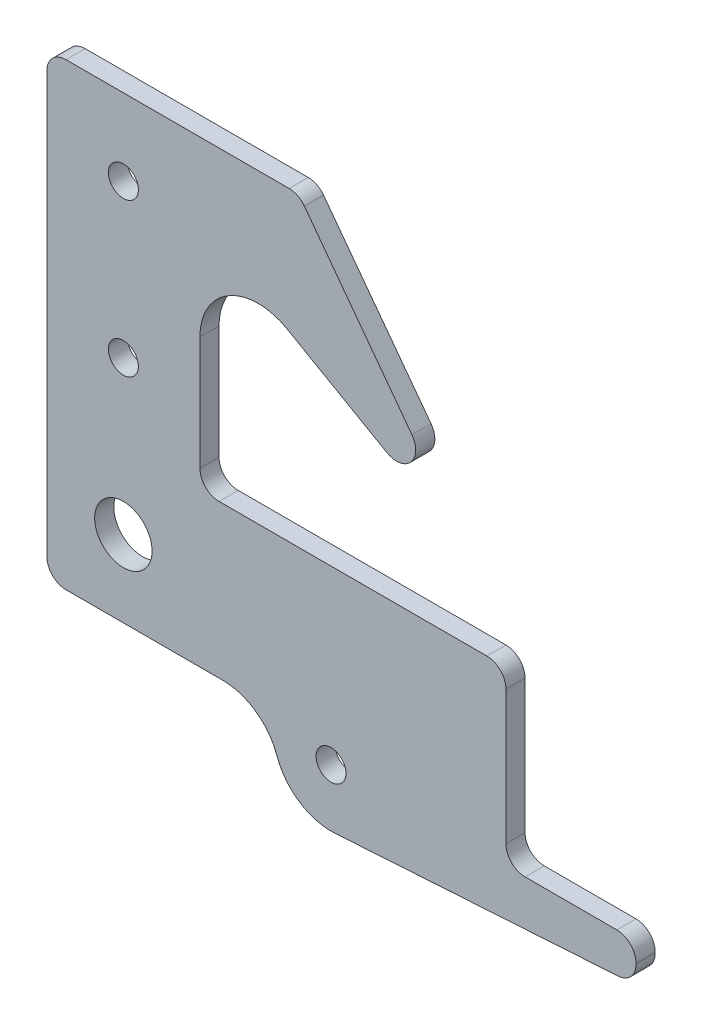
ISO-10303-21;
HEADER;
FILE_DESCRIPTION(('STEP AP214'),'2;1');
FILE_NAME('part.step','',(''),(''),'','','');
FILE_SCHEMA(('AUTOMOTIVE_DESIGN { 1 0 10303 214 1 1 1 1 }'));
ENDSEC;
DATA;
#1=APPLICATION_CONTEXT('core data for automotive mechanical design processes');
#2=APPLICATION_PROTOCOL_DEFINITION('international standard','automotive_design',2000,#1);
#3=PRODUCT_CONTEXT('',#1,'mechanical');
#4=PRODUCT('Part','Part','',(#3));
#5=PRODUCT_RELATED_PRODUCT_CATEGORY('part','',(#4));
#6=PRODUCT_DEFINITION_FORMATION('','',#4);
#7=PRODUCT_DEFINITION_CONTEXT('part definition',#1,'design');
#8=PRODUCT_DEFINITION('design','',#6,#7);
#9=PRODUCT_DEFINITION_SHAPE('','',#8);
#10=(LENGTH_UNIT() NAMED_UNIT(*) SI_UNIT(.MILLI.,.METRE.));
#11=(NAMED_UNIT(*) PLANE_ANGLE_UNIT() SI_UNIT($,.RADIAN.));
#12=(NAMED_UNIT(*) SI_UNIT($,.STERADIAN.) SOLID_ANGLE_UNIT());
#13=UNCERTAINTY_MEASURE_WITH_UNIT(LENGTH_MEASURE(1.E-05),#10,'distance_accuracy_value','');
#14=(GEOMETRIC_REPRESENTATION_CONTEXT(3) GLOBAL_UNCERTAINTY_ASSIGNED_CONTEXT((#13)) GLOBAL_UNIT_ASSIGNED_CONTEXT((#10,
#11,#12)) REPRESENTATION_CONTEXT('',''));
#15=CARTESIAN_POINT('',(0.,0.,0.));
#16=DIRECTION('',(0.,0.,1.));
#17=DIRECTION('',(1.,0.,0.));
#18=AXIS2_PLACEMENT_3D('',#15,#16,#17);
#19=CARTESIAN_POINT('',(47.7660859823863,680.604765488538,-3.175));
#20=DIRECTION('',(0.,0.,1.));
#21=DIRECTION('',(1.,0.,0.));
#22=AXIS2_PLACEMENT_3D('',#19,#20,#21);
#23=CYLINDRICAL_SURFACE('',#22,9.6660859823866);
#24=CARTESIAN_POINT('',(47.7660859823863,680.604765488538,0.));
#25=DIRECTION('',(0.,0.,1.));
#26=DIRECTION('',(1.,0.,0.));
#27=AXIS2_PLACEMENT_3D('',#24,#25,#26);
#28=CIRCLE('',#27,9.6660859823866);
#29=CARTESIAN_POINT('',(52.5660867322222,688.99483169927,0.));
#30=VERTEX_POINT('',#29);
#31=CARTESIAN_POINT('',(38.0999999999997,680.604765488538,0.));
#32=VERTEX_POINT('',#31);
#33=EDGE_CURVE('E300',#30,#32,#28,.T.);
#34=ORIENTED_EDGE('',*,*,#33,.T.);
#35=DIRECTION('',(0.,0.,1.));
#36=VECTOR('',#35,1.);
#37=CARTESIAN_POINT('',(38.0999999999997,680.604765488538,-3.175));
#38=LINE('',#37,#36);
#39=CARTESIAN_POINT('',(38.0999999999997,680.604765488538,-3.175));
#40=VERTEX_POINT('',#39);
#41=EDGE_CURVE('E231',#40,#32,#38,.T.);
#42=ORIENTED_EDGE('',*,*,#41,.F.);
#43=CARTESIAN_POINT('',(47.7660859823863,680.604765488538,-3.175));
#44=DIRECTION('',(0.,0.,1.));
#45=DIRECTION('',(1.,0.,0.));
#46=AXIS2_PLACEMENT_3D('',#43,#44,#45);
#47=CIRCLE('',#46,9.6660859823866);
#48=CARTESIAN_POINT('',(52.5660867322222,688.99483169927,-3.175));
#49=VERTEX_POINT('',#48);
#50=EDGE_CURVE('E211',#49,#40,#47,.T.);
#51=ORIENTED_EDGE('',*,*,#50,.F.);
#52=DIRECTION('',(0.,0.,1.));
#53=VECTOR('',#52,1.);
#54=CARTESIAN_POINT('',(52.5660867322222,688.99483169927,-3.175));
#55=LINE('',#54,#53);
#56=EDGE_CURVE('E219',#49,#30,#55,.T.);
#57=ORIENTED_EDGE('',*,*,#56,.T.);
#58=EDGE_LOOP('',(#34,#42,#51,#57));
#59=FACE_BOUND('',#58,.T.);
#60=ADVANCED_FACE('F47',(#59),#23,.F.);
#61=CARTESIAN_POINT('',(38.100000000001,0.,-3.175));
#62=DIRECTION('',(-1.,0.,0.));
#63=DIRECTION('',(0.,-1.,0.));
#64=AXIS2_PLACEMENT_3D('',#61,#62,#63);
#65=PLANE('',#64);
#66=DIRECTION('',(0.,-1.,0.));
#67=VECTOR('',#66,1.);
#68=CARTESIAN_POINT('',(38.100000000001,0.,0.));
#69=LINE('',#68,#67);
#70=CARTESIAN_POINT('',(38.0999999999997,661.7335,0.));
#71=VERTEX_POINT('',#70);
#72=EDGE_CURVE('E350',#32,#71,#69,.T.);
#73=ORIENTED_EDGE('',*,*,#72,.T.);
#74=DIRECTION('',(0.,0.,1.));
#75=VECTOR('',#74,1.);
#76=CARTESIAN_POINT('',(38.0999999999997,661.7335,-3.175));
#77=LINE('',#76,#75);
#78=CARTESIAN_POINT('',(38.0999999999997,661.7335,-3.175));
#79=VERTEX_POINT('',#78);
#80=EDGE_CURVE('E439',#71,#79,#77,.F.);
#81=ORIENTED_EDGE('',*,*,#80,.T.);
#82=DIRECTION('',(0.,-1.,0.));
#83=VECTOR('',#82,1.);
#84=CARTESIAN_POINT('',(38.100000000001,0.,-3.175));
#85=LINE('',#84,#83);
#86=EDGE_CURVE('E282',#40,#79,#85,.T.);
#87=ORIENTED_EDGE('',*,*,#86,.F.);
#88=ORIENTED_EDGE('',*,*,#41,.T.);
#89=EDGE_LOOP('',(#73,#81,#87,#88));
#90=FACE_BOUND('',#89,.T.);
#91=ADVANCED_FACE('F555',(#90),#65,.F.);
#92=CARTESIAN_POINT('',(0.,658.5585,-3.175));
#93=DIRECTION('',(0.,-1.,0.));
#94=DIRECTION('',(0.,0.,-1.));
#95=AXIS2_PLACEMENT_3D('',#92,#93,#94);
#96=PLANE('',#95);
#97=DIRECTION('',(1.,0.,0.));
#98=VECTOR('',#97,1.);
#99=CARTESIAN_POINT('',(0.,658.5585,-3.175));
#100=LINE('',#99,#98);
#101=CARTESIAN_POINT('',(41.2749999999997,658.5585,-3.175));
#102=VERTEX_POINT('',#101);
#103=CARTESIAN_POINT('',(85.7249999999999,658.5585,-3.175));
#104=VERTEX_POINT('',#103);
#105=EDGE_CURVE('E278',#102,#104,#100,.T.);
#106=ORIENTED_EDGE('',*,*,#105,.F.);
#107=DIRECTION('',(0.,0.,1.));
#108=VECTOR('',#107,1.);
#109=CARTESIAN_POINT('',(41.2749999999997,658.5585,0.));
#110=LINE('',#109,#108);
#111=CARTESIAN_POINT('',(41.2749999999997,658.5585,0.));
#112=VERTEX_POINT('',#111);
#113=EDGE_CURVE('E435',#102,#112,#110,.T.);
#114=ORIENTED_EDGE('',*,*,#113,.T.);
#115=DIRECTION('',(1.,0.,0.));
#116=VECTOR('',#115,1.);
#117=CARTESIAN_POINT('',(0.,658.5585,0.));
#118=LINE('',#117,#116);
#119=CARTESIAN_POINT('',(85.7249999999999,658.5585,0.));
#120=VERTEX_POINT('',#119);
#121=EDGE_CURVE('E346',#112,#120,#118,.T.);
#122=ORIENTED_EDGE('',*,*,#121,.T.);
#123=DIRECTION('',(0.,0.,1.));
#124=VECTOR('',#123,1.);
#125=CARTESIAN_POINT('',(85.7249999999999,658.5585,-3.175));
#126=LINE('',#125,#124);
#127=EDGE_CURVE('E432',#120,#104,#126,.F.);
#128=ORIENTED_EDGE('',*,*,#127,.T.);
#129=EDGE_LOOP('',(#106,#114,#122,#128));
#130=FACE_BOUND('',#129,.T.);
#131=ADVANCED_FACE('F562',(#130),#96,.F.);
#132=CARTESIAN_POINT('',(88.8999999999999,0.,-3.175));
#133=DIRECTION('',(-1.,0.,0.));
#134=DIRECTION('',(0.,0.,1.));
#135=AXIS2_PLACEMENT_3D('',#132,#133,#134);
#136=PLANE('',#135);
#137=DIRECTION('',(0.,-1.,0.));
#138=VECTOR('',#137,1.);
#139=CARTESIAN_POINT('',(88.8999999999999,0.,-3.175));
#140=LINE('',#139,#138);
#141=CARTESIAN_POINT('',(88.8999999999999,655.3835,-3.175));
#142=VERTEX_POINT('',#141);
#143=CARTESIAN_POINT('',(88.8999999999999,633.1585,-3.175));
#144=VERTEX_POINT('',#143);
#145=EDGE_CURVE('E274',#142,#144,#140,.T.);
#146=ORIENTED_EDGE('',*,*,#145,.F.);
#147=DIRECTION('',(0.,0.,1.));
#148=VECTOR('',#147,1.);
#149=CARTESIAN_POINT('',(88.8999999999999,655.3835,-3.175));
#150=LINE('',#149,#148);
#151=CARTESIAN_POINT('',(88.8999999999999,655.3835,0.));
#152=VERTEX_POINT('',#151);
#153=EDGE_CURVE('E445',#142,#152,#150,.T.);
#154=ORIENTED_EDGE('',*,*,#153,.T.);
#155=DIRECTION('',(0.,-1.,0.));
#156=VECTOR('',#155,1.);
#157=CARTESIAN_POINT('',(88.8999999999999,0.,0.));
#158=LINE('',#157,#156);
#159=CARTESIAN_POINT('',(88.8999999999999,633.1585,0.));
#160=VERTEX_POINT('',#159);
#161=EDGE_CURVE('E342',#152,#160,#158,.T.);
#162=ORIENTED_EDGE('',*,*,#161,.T.);
#163=DIRECTION('',(0.,0.,1.));
#164=VECTOR('',#163,1.);
#165=CARTESIAN_POINT('',(88.8999999999999,633.1585,-3.175));
#166=LINE('',#165,#164);
#167=EDGE_CURVE('E442',#160,#144,#166,.F.);
#168=ORIENTED_EDGE('',*,*,#167,.T.);
#169=EDGE_LOOP('',(#146,#154,#162,#168));
#170=FACE_BOUND('',#169,.T.);
#171=ADVANCED_FACE('F490',(#170),#136,.F.);
#172=CARTESIAN_POINT('',(0.,629.9835,-3.175));
#173=DIRECTION('',(0.,-1.,0.));
#174=DIRECTION('',(0.,0.,-1.));
#175=AXIS2_PLACEMENT_3D('',#172,#173,#174);
#176=PLANE('',#175);
#177=DIRECTION('',(1.,0.,0.));
#178=VECTOR('',#177,1.);
#179=CARTESIAN_POINT('',(0.,629.9835,0.));
#180=LINE('',#179,#178);
#181=CARTESIAN_POINT('',(92.0749999999999,629.9835,0.));
#182=VERTEX_POINT('',#181);
#183=CARTESIAN_POINT('',(107.315,629.9835,0.));
#184=VERTEX_POINT('',#183);
#185=EDGE_CURVE('E338',#182,#184,#180,.T.);
#186=ORIENTED_EDGE('',*,*,#185,.T.);
#187=DIRECTION('',(0.,0.,1.));
#188=VECTOR('',#187,1.);
#189=CARTESIAN_POINT('',(107.315,629.9835,-3.175));
#190=LINE('',#189,#188);
#191=CARTESIAN_POINT('',(107.315,629.9835,-3.175));
#192=VERTEX_POINT('',#191);
#193=EDGE_CURVE('E412',#184,#192,#190,.F.);
#194=ORIENTED_EDGE('',*,*,#193,.T.);
#195=DIRECTION('',(1.,0.,0.));
#196=VECTOR('',#195,1.);
#197=CARTESIAN_POINT('',(0.,629.9835,-3.175));
#198=LINE('',#197,#196);
#199=CARTESIAN_POINT('',(92.0749999999999,629.9835,-3.175));
#200=VERTEX_POINT('',#199);
#201=EDGE_CURVE('E271',#200,#192,#198,.T.);
#202=ORIENTED_EDGE('',*,*,#201,.F.);
#203=DIRECTION('',(0.,0.,1.));
#204=VECTOR('',#203,1.);
#205=CARTESIAN_POINT('',(92.0749999999999,629.9835,0.));
#206=LINE('',#205,#204);
#207=EDGE_CURVE('E408',#200,#182,#206,.T.);
#208=ORIENTED_EDGE('',*,*,#207,.T.);
#209=EDGE_LOOP('',(#186,#194,#202,#208));
#210=FACE_BOUND('',#209,.T.);
#211=ADVANCED_FACE('F497',(#210),#176,.F.);
#212=CARTESIAN_POINT('',(110.49,0.,-3.175));
#213=DIRECTION('',(-1.,0.,0.));
#214=DIRECTION('',(0.,0.,1.));
#215=AXIS2_PLACEMENT_3D('',#212,#213,#214);
#216=PLANE('',#215);
#217=DIRECTION('',(0.,-1.,0.));
#218=VECTOR('',#217,1.);
#219=CARTESIAN_POINT('',(110.49,0.,-3.175));
#220=LINE('',#219,#218);
#221=CARTESIAN_POINT('',(110.49,626.8085,-3.175));
#222=VERTEX_POINT('',#221);
#223=CARTESIAN_POINT('',(110.49,626.61448071619,-3.175));
#224=VERTEX_POINT('',#223);
#225=EDGE_CURVE('E267',#222,#224,#220,.T.);
#226=ORIENTED_EDGE('',*,*,#225,.F.);
#227=DIRECTION('',(0.,0.,1.));
#228=VECTOR('',#227,1.);
#229=CARTESIAN_POINT('',(110.49,626.8085,-3.175));
#230=LINE('',#229,#228);
#231=CARTESIAN_POINT('',(110.49,626.8085,0.));
#232=VERTEX_POINT('',#231);
#233=EDGE_CURVE('E386',#222,#232,#230,.T.);
#234=ORIENTED_EDGE('',*,*,#233,.T.);
#235=DIRECTION('',(0.,-1.,0.));
#236=VECTOR('',#235,1.);
#237=CARTESIAN_POINT('',(110.49,0.,0.));
#238=LINE('',#237,#236);
#239=CARTESIAN_POINT('',(110.49,626.61448071619,0.));
#240=VERTEX_POINT('',#239);
#241=EDGE_CURVE('E334',#232,#240,#238,.T.);
#242=ORIENTED_EDGE('',*,*,#241,.T.);
#243=DIRECTION('',(0.,0.,1.));
#244=VECTOR('',#243,1.);
#245=CARTESIAN_POINT('',(110.49,626.61448071619,-3.175));
#246=LINE('',#245,#244);
#247=EDGE_CURVE('E367',#240,#224,#246,.F.);
#248=ORIENTED_EDGE('',*,*,#247,.T.);
#249=EDGE_LOOP('',(#226,#234,#242,#248));
#250=FACE_BOUND('',#249,.T.);
#251=ADVANCED_FACE('F505',(#250),#216,.F.);
#252=CARTESIAN_POINT('',(-38.7552708870284,614.216559323233,-3.175));
#253=DIRECTION('',(0.0629718506438215,-0.998015303503154,0.));
#254=DIRECTION('',(0.998015303503154,0.0629718506438215,0.));
#255=AXIS2_PLACEMENT_3D('',#252,#253,#254);
#256=PLANE('',#255);
#257=DIRECTION('',(0.998015303503154,0.0629718506438215,0.));
#258=VECTOR('',#257,1.);
#259=CARTESIAN_POINT('',(-38.7552708870284,614.216559323233,-3.175));
#260=LINE('',#259,#258);
#261=CARTESIAN_POINT('',(60.4703191195205,620.477404234132,-3.175));
#262=VERTEX_POINT('',#261);
#263=CARTESIAN_POINT('',(107.514935625794,623.445782127568,-3.175));
#264=VERTEX_POINT('',#263);
#265=EDGE_CURVE('E263',#262,#264,#260,.T.);
#266=ORIENTED_EDGE('',*,*,#265,.T.);
#267=DIRECTION('',(0.,0.,1.));
#268=VECTOR('',#267,1.);
#269=CARTESIAN_POINT('',(107.514935625794,623.445782127568,0.));
#270=LINE('',#269,#268);
#271=CARTESIAN_POINT('',(107.514935625794,623.445782127568,0.));
#272=VERTEX_POINT('',#271);
#273=EDGE_CURVE('E465',#264,#272,#270,.T.);
#274=ORIENTED_EDGE('',*,*,#273,.T.);
#275=DIRECTION('',(0.998015303503154,0.0629718506438215,0.));
#276=VECTOR('',#275,1.);
#277=CARTESIAN_POINT('',(-38.7552708870284,614.216559323233,0.));
#278=LINE('',#277,#276);
#279=CARTESIAN_POINT('',(60.4703191195205,620.477404234132,0.));
#280=VERTEX_POINT('',#279);
#281=EDGE_CURVE('E330',#280,#272,#278,.T.);
#282=ORIENTED_EDGE('',*,*,#281,.F.);
#283=DIRECTION('',(0.,0.,1.));
#284=VECTOR('',#283,1.);
#285=CARTESIAN_POINT('',(60.4703191195205,620.477404234132,-3.175));
#286=LINE('',#285,#284);
#287=EDGE_CURVE('E368',#262,#280,#286,.T.);
#288=ORIENTED_EDGE('',*,*,#287,.F.);
#289=EDGE_LOOP('',(#266,#274,#282,#288));
#290=FACE_BOUND('',#289,.T.);
#291=ADVANCED_FACE('F513',(#290),#256,.T.);
#292=CARTESIAN_POINT('',(59.8705122421381,629.9835,-3.175));
#293=DIRECTION('',(0.,0.,1.));
#294=DIRECTION('',(1.,0.,0.));
#295=AXIS2_PLACEMENT_3D('',#292,#293,#294);
#296=CYLINDRICAL_SURFACE('',#295,9.52499999999995);
#297=CARTESIAN_POINT('',(59.8705122421381,629.9835,0.));
#298=DIRECTION('',(0.,0.,1.));
#299=DIRECTION('',(1.,0.,0.));
#300=AXIS2_PLACEMENT_3D('',#297,#298,#299);
#301=CIRCLE('',#300,9.52499999999995);
#302=CARTESIAN_POINT('',(50.890256121069,626.8085,0.));
#303=VERTEX_POINT('',#302);
#304=EDGE_CURVE('E326',#303,#280,#301,.T.);
#305=ORIENTED_EDGE('',*,*,#304,.F.);
#306=DIRECTION('',(0.,0.,1.));
#307=VECTOR('',#306,1.);
#308=CARTESIAN_POINT('',(50.890256121069,626.8085,-3.175));
#309=LINE('',#308,#307);
#310=CARTESIAN_POINT('',(50.890256121069,626.8085,-3.175));
#311=VERTEX_POINT('',#310);
#312=EDGE_CURVE('E371',#311,#303,#309,.T.);
#313=ORIENTED_EDGE('',*,*,#312,.F.);
#314=CARTESIAN_POINT('',(59.8705122421381,629.9835,-3.175));
#315=DIRECTION('',(0.,0.,1.));
#316=DIRECTION('',(1.,0.,0.));
#317=AXIS2_PLACEMENT_3D('',#314,#315,#316);
#318=CIRCLE('',#317,9.52499999999995);
#319=EDGE_CURVE('E259',#311,#262,#318,.T.);
#320=ORIENTED_EDGE('',*,*,#319,.T.);
#321=ORIENTED_EDGE('',*,*,#287,.T.);
#322=EDGE_LOOP('',(#305,#313,#320,#321));
#323=FACE_BOUND('',#322,.T.);
#324=ADVANCED_FACE('F517',(#323),#296,.T.);
#325=CARTESIAN_POINT('',(41.9099999999998,623.6335,-3.175));
#326=DIRECTION('',(0.,0.,1.));
#327=DIRECTION('',(1.,0.,0.));
#328=AXIS2_PLACEMENT_3D('',#325,#326,#327);
#329=CYLINDRICAL_SURFACE('',#328,9.52500000000001);
#330=CARTESIAN_POINT('',(41.9099999999998,623.6335,0.));
#331=DIRECTION('',(0.,0.,1.));
#332=DIRECTION('',(1.,0.,0.));
#333=AXIS2_PLACEMENT_3D('',#330,#331,#332);
#334=CIRCLE('',#333,9.52500000000001);
#335=CARTESIAN_POINT('',(41.9099999999998,633.1585,0.));
#336=VERTEX_POINT('',#335);
#337=EDGE_CURVE('E322',#303,#336,#334,.T.);
#338=ORIENTED_EDGE('',*,*,#337,.T.);
#339=DIRECTION('',(0.,0.,1.));
#340=VECTOR('',#339,1.);
#341=CARTESIAN_POINT('',(41.9099999999998,633.1585,-3.175));
#342=LINE('',#341,#340);
#343=CARTESIAN_POINT('',(41.9099999999998,633.1585,-3.175));
#344=VERTEX_POINT('',#343);
#345=EDGE_CURVE('E374',#344,#336,#342,.T.);
#346=ORIENTED_EDGE('',*,*,#345,.F.);
#347=CARTESIAN_POINT('',(41.9099999999998,623.6335,-3.175));
#348=DIRECTION('',(0.,0.,1.));
#349=DIRECTION('',(1.,0.,0.));
#350=AXIS2_PLACEMENT_3D('',#347,#348,#349);
#351=CIRCLE('',#350,9.52500000000001);
#352=EDGE_CURVE('E255',#311,#344,#351,.T.);
#353=ORIENTED_EDGE('',*,*,#352,.F.);
#354=ORIENTED_EDGE('',*,*,#312,.T.);
#355=EDGE_LOOP('',(#338,#346,#353,#354));
#356=FACE_BOUND('',#355,.T.);
#357=ADVANCED_FACE('F523',(#356),#329,.F.);
#358=CARTESIAN_POINT('',(0.,633.1585,-3.175));
#359=DIRECTION('',(0.,-1.,0.));
#360=DIRECTION('',(0.,0.,-1.));
#361=AXIS2_PLACEMENT_3D('',#358,#359,#360);
#362=PLANE('',#361);
#363=DIRECTION('',(1.,0.,0.));
#364=VECTOR('',#363,1.);
#365=CARTESIAN_POINT('',(0.,633.1585,0.));
#366=LINE('',#365,#364);
#367=CARTESIAN_POINT('',(15.8749999999999,633.1585,0.));
#368=VERTEX_POINT('',#367);
#369=EDGE_CURVE('E319',#368,#336,#366,.T.);
#370=ORIENTED_EDGE('',*,*,#369,.F.);
#371=DIRECTION('',(0.,0.,1.));
#372=VECTOR('',#371,1.);
#373=CARTESIAN_POINT('',(15.8749999999999,633.1585,-3.175));
#374=LINE('',#373,#372);
#375=CARTESIAN_POINT('',(15.8749999999999,633.1585,-3.175));
#376=VERTEX_POINT('',#375);
#377=EDGE_CURVE('E456',#368,#376,#374,.F.);
#378=ORIENTED_EDGE('',*,*,#377,.T.);
#379=DIRECTION('',(1.,0.,0.));
#380=VECTOR('',#379,1.);
#381=CARTESIAN_POINT('',(0.,633.1585,-3.175));
#382=LINE('',#381,#380);
#383=EDGE_CURVE('E252',#376,#344,#382,.T.);
#384=ORIENTED_EDGE('',*,*,#383,.T.);
#385=ORIENTED_EDGE('',*,*,#345,.T.);
#386=EDGE_LOOP('',(#370,#378,#384,#385));
#387=FACE_BOUND('',#386,.T.);
#388=ADVANCED_FACE('F527',(#387),#362,.T.);
#389=CARTESIAN_POINT('',(12.7000000000007,0.,-3.175));
#390=DIRECTION('',(-1.,0.,0.));
#391=DIRECTION('',(0.,-1.,0.));
#392=AXIS2_PLACEMENT_3D('',#389,#390,#391);
#393=PLANE('',#392);
#394=DIRECTION('',(0.,-1.,0.));
#395=VECTOR('',#394,1.);
#396=CARTESIAN_POINT('',(12.7000000000007,0.,-3.175));
#397=LINE('',#396,#395);
#398=CARTESIAN_POINT('',(12.6999999999998,706.1835,-3.175));
#399=VERTEX_POINT('',#398);
#400=CARTESIAN_POINT('',(12.6999999999999,636.3335,-3.175));
#401=VERTEX_POINT('',#400);
#402=EDGE_CURVE('E248',#399,#401,#397,.T.);
#403=ORIENTED_EDGE('',*,*,#402,.T.);
#404=DIRECTION('',(0.,0.,1.));
#405=VECTOR('',#404,1.);
#406=CARTESIAN_POINT('',(12.6999999999999,636.3335,-3.175));
#407=LINE('',#406,#405);
#408=CARTESIAN_POINT('',(12.6999999999999,636.3335,0.));
#409=VERTEX_POINT('',#408);
#410=EDGE_CURVE('E452',#401,#409,#407,.T.);
#411=ORIENTED_EDGE('',*,*,#410,.T.);
#412=DIRECTION('',(0.,-1.,0.));
#413=VECTOR('',#412,1.);
#414=CARTESIAN_POINT('',(12.7000000000007,0.,0.));
#415=LINE('',#414,#413);
#416=CARTESIAN_POINT('',(12.6999999999998,706.1835,0.));
#417=VERTEX_POINT('',#416);
#418=EDGE_CURVE('E315',#417,#409,#415,.T.);
#419=ORIENTED_EDGE('',*,*,#418,.F.);
#420=DIRECTION('',(0.,0.,1.));
#421=VECTOR('',#420,1.);
#422=CARTESIAN_POINT('',(12.6999999999998,706.1835,-3.175));
#423=LINE('',#422,#421);
#424=EDGE_CURVE('E449',#417,#399,#423,.F.);
#425=ORIENTED_EDGE('',*,*,#424,.T.);
#426=EDGE_LOOP('',(#403,#411,#419,#425));
#427=FACE_BOUND('',#426,.T.);
#428=ADVANCED_FACE('F535',(#427),#393,.T.);
#429=CARTESIAN_POINT('',(0.,709.3585,-3.175));
#430=DIRECTION('',(0.,-1.,0.));
#431=DIRECTION('',(0.,0.,-1.));
#432=AXIS2_PLACEMENT_3D('',#429,#430,#431);
#433=PLANE('',#432);
#434=DIRECTION('',(1.,0.,0.));
#435=VECTOR('',#434,1.);
#436=CARTESIAN_POINT('',(0.,709.3585,-3.175));
#437=LINE('',#436,#435);
#438=CARTESIAN_POINT('',(15.8749999999998,709.3585,-3.175));
#439=VERTEX_POINT('',#438);
#440=CARTESIAN_POINT('',(52.9061953898128,709.3585,-3.175));
#441=VERTEX_POINT('',#440);
#442=EDGE_CURVE('E245',#439,#441,#437,.T.);
#443=ORIENTED_EDGE('',*,*,#442,.F.);
#444=DIRECTION('',(0.,0.,1.));
#445=VECTOR('',#444,1.);
#446=CARTESIAN_POINT('',(15.8749999999998,709.3585,0.));
#447=LINE('',#446,#445);
#448=CARTESIAN_POINT('',(15.8749999999998,709.3585,0.));
#449=VERTEX_POINT('',#448);
#450=EDGE_CURVE('E461',#439,#449,#447,.T.);
#451=ORIENTED_EDGE('',*,*,#450,.T.);
#452=DIRECTION('',(1.,0.,0.));
#453=VECTOR('',#452,1.);
#454=CARTESIAN_POINT('',(0.,709.3585,0.));
#455=LINE('',#454,#453);
#456=CARTESIAN_POINT('',(52.9061953898128,709.3585,0.));
#457=VERTEX_POINT('',#456);
#458=EDGE_CURVE('E312',#449,#457,#455,.T.);
#459=ORIENTED_EDGE('',*,*,#458,.T.);
#460=DIRECTION('',(0.,0.,1.));
#461=VECTOR('',#460,1.);
#462=CARTESIAN_POINT('',(52.9061953898128,709.3585,-3.175));
#463=LINE('',#462,#461);
#464=EDGE_CURVE('E71',#457,#441,#463,.F.);
#465=ORIENTED_EDGE('',*,*,#464,.T.);
#466=EDGE_LOOP('',(#443,#451,#459,#465));
#467=FACE_BOUND('',#466,.T.);
#468=ADVANCED_FACE('F541',(#467),#433,.F.);
#469=CARTESIAN_POINT('',(374.948998722203,279.545385633689,-3.175));
#470=DIRECTION('',(-0.801706979741773,-0.597717256429261,0.));
#471=DIRECTION('',(0.597717256429262,-0.801706979741774,0.));
#472=AXIS2_PLACEMENT_3D('',#469,#470,#471);
#473=PLANE('',#472);
#474=DIRECTION('',(0.597717256429262,-0.801706979741774,0.));
#475=VECTOR('',#474,1.);
#476=CARTESIAN_POINT('',(374.948998722203,279.545385633689,-3.175));
#477=LINE('',#476,#475);
#478=CARTESIAN_POINT('',(55.4516150504928,708.081252289163,-3.175));
#479=VERTEX_POINT('',#478);
#480=CARTESIAN_POINT('',(73.2958650068136,684.147093480194,-3.175));
#481=VERTEX_POINT('',#480);
#482=EDGE_CURVE('E242',#479,#481,#477,.T.);
#483=ORIENTED_EDGE('',*,*,#482,.F.);
#484=DIRECTION('',(0.,0.,1.));
#485=VECTOR('',#484,1.);
#486=CARTESIAN_POINT('',(55.4516150504929,708.081252289163,-3.175));
#487=LINE('',#486,#485);
#488=CARTESIAN_POINT('',(55.4516150504928,708.081252289163,0.));
#489=VERTEX_POINT('',#488);
#490=EDGE_CURVE('E469',#479,#489,#487,.T.);
#491=ORIENTED_EDGE('',*,*,#490,.T.);
#492=DIRECTION('',(0.597717256429262,-0.801706979741774,0.));
#493=VECTOR('',#492,1.);
#494=CARTESIAN_POINT('',(374.948998722203,279.545385633689,0.));
#495=LINE('',#494,#493);
#496=CARTESIAN_POINT('',(73.2958650068136,684.147093480194,0.));
#497=VERTEX_POINT('',#496);
#498=EDGE_CURVE('E309',#489,#497,#495,.T.);
#499=ORIENTED_EDGE('',*,*,#498,.T.);
#500=DIRECTION('',(0.,0.,1.));
#501=VECTOR('',#500,1.);
#502=CARTESIAN_POINT('',(73.2958650068136,684.147093480194,-3.175));
#503=LINE('',#502,#501);
#504=EDGE_CURVE('E378',#481,#497,#503,.T.);
#505=ORIENTED_EDGE('',*,*,#504,.F.);
#506=EDGE_LOOP('',(#483,#491,#499,#505));
#507=FACE_BOUND('',#506,.T.);
#508=ADVANCED_FACE('F547',(#507),#473,.F.);
#509=CARTESIAN_POINT('',(70.7504453461335,682.249341191031,-3.175));
#510=DIRECTION('',(0.,0.,1.));
#511=DIRECTION('',(1.,0.,0.));
#512=AXIS2_PLACEMENT_3D('',#509,#510,#511);
#513=CYLINDRICAL_SURFACE('',#512,3.17500000000003);
#514=CARTESIAN_POINT('',(70.7504453461335,682.249341191031,0.));
#515=DIRECTION('',(0.,0.,1.));
#516=DIRECTION('',(1.,0.,0.));
#517=AXIS2_PLACEMENT_3D('',#514,#515,#516);
#518=CIRCLE('',#517,3.17500000000003);
#519=CARTESIAN_POINT('',(69.1737986653054,679.493472862567,0.));
#520=VERTEX_POINT('',#519);
#521=EDGE_CURVE('E305',#520,#497,#518,.T.);
#522=ORIENTED_EDGE('',*,*,#521,.F.);
#523=DIRECTION('',(0.,0.,1.));
#524=VECTOR('',#523,1.);
#525=CARTESIAN_POINT('',(69.1737986653054,679.493472862567,-3.175));
#526=LINE('',#525,#524);
#527=CARTESIAN_POINT('',(69.1737986653054,679.493472862567,-3.175));
#528=VERTEX_POINT('',#527);
#529=EDGE_CURVE('E227',#528,#520,#526,.T.);
#530=ORIENTED_EDGE('',*,*,#529,.F.);
#531=CARTESIAN_POINT('',(70.7504453461335,682.249341191031,-3.175));
#532=DIRECTION('',(0.,0.,1.));
#533=DIRECTION('',(1.,0.,0.));
#534=AXIS2_PLACEMENT_3D('',#531,#532,#533);
#535=CIRCLE('',#534,3.17500000000003);
#536=EDGE_CURVE('E214',#528,#481,#535,.T.);
#537=ORIENTED_EDGE('',*,*,#536,.T.);
#538=ORIENTED_EDGE('',*,*,#504,.T.);
#539=EDGE_LOOP('',(#522,#530,#537,#538));
#540=FACE_BOUND('',#539,.T.);
#541=ADVANCED_FACE('F551',(#540),#513,.T.);
#542=CARTESIAN_POINT('',(25.3999999999997,645.8585,-3.175));
#543=DIRECTION('',(0.,0.,1.));
#544=DIRECTION('',(1.,0.,0.));
#545=AXIS2_PLACEMENT_3D('',#542,#543,#544);
#546=CYLINDRICAL_SURFACE('',#545,4.76250000000006);
#547=CARTESIAN_POINT('',(25.3999999999997,645.8585,-3.175));
#548=DIRECTION('',(0.,0.,1.));
#549=DIRECTION('',(1.,0.,0.));
#550=AXIS2_PLACEMENT_3D('',#547,#548,#549);
#551=CIRCLE('',#550,4.76250000000006);
#552=CARTESIAN_POINT('',(30.1624999999998,645.8585,-3.175));
#553=VERTEX_POINT('',#552);
#554=EDGE_CURVE('E293',#553,#553,#551,.T.);
#555=ORIENTED_EDGE('',*,*,#554,.F.);
#556=EDGE_LOOP('',(#555));
#557=FACE_BOUND('',#556,.T.);
#558=CARTESIAN_POINT('',(25.3999999999997,645.8585,0.));
#559=DIRECTION('',(0.,0.,1.));
#560=DIRECTION('',(1.,0.,0.));
#561=AXIS2_PLACEMENT_3D('',#558,#559,#560);
#562=CIRCLE('',#561,4.76250000000006);
#563=CARTESIAN_POINT('',(30.1624999999998,645.8585,0.));
#564=VERTEX_POINT('',#563);
#565=EDGE_CURVE('E237',#564,#564,#562,.T.);
#566=ORIENTED_EDGE('',*,*,#565,.T.);
#567=EDGE_LOOP('',(#566));
#568=FACE_BOUND('',#567,.T.);
#569=ADVANCED_FACE('F599',(#557,#568),#546,.F.);
#570=CARTESIAN_POINT('',(25.3999999999997,671.2585,-3.175));
#571=DIRECTION('',(0.,0.,1.));
#572=DIRECTION('',(1.,0.,0.));
#573=AXIS2_PLACEMENT_3D('',#570,#571,#572);
#574=CYLINDRICAL_SURFACE('',#573,2.48920000000018);
#575=CARTESIAN_POINT('',(25.3999999999997,671.2585,-3.175));
#576=DIRECTION('',(0.,0.,1.));
#577=DIRECTION('',(1.,0.,0.));
#578=AXIS2_PLACEMENT_3D('',#575,#576,#577);
#579=CIRCLE('',#578,2.48920000000018);
#580=CARTESIAN_POINT('',(27.8891999999999,671.2585,-3.175));
#581=VERTEX_POINT('',#580);
#582=EDGE_CURVE('E289',#581,#581,#579,.T.);
#583=ORIENTED_EDGE('',*,*,#582,.F.);
#584=EDGE_LOOP('',(#583));
#585=FACE_BOUND('',#584,.T.);
#586=CARTESIAN_POINT('',(25.3999999999997,671.2585,0.));
#587=DIRECTION('',(0.,0.,1.));
#588=DIRECTION('',(1.,0.,0.));
#589=AXIS2_PLACEMENT_3D('',#586,#587,#588);
#590=CIRCLE('',#589,2.48920000000018);
#591=CARTESIAN_POINT('',(27.8891999999999,671.2585,0.));
#592=VERTEX_POINT('',#591);
#593=EDGE_CURVE('E358',#592,#592,#590,.T.);
#594=ORIENTED_EDGE('',*,*,#593,.T.);
#595=EDGE_LOOP('',(#594));
#596=FACE_BOUND('',#595,.T.);
#597=ADVANCED_FACE('F602',(#585,#596),#574,.F.);
#598=CARTESIAN_POINT('',(25.3999999999997,696.6585,-3.175));
#599=DIRECTION('',(0.,0.,1.));
#600=DIRECTION('',(1.,0.,0.));
#601=AXIS2_PLACEMENT_3D('',#598,#599,#600);
#602=CYLINDRICAL_SURFACE('',#601,2.48920000000019);
#603=CARTESIAN_POINT('',(25.3999999999997,696.6585,-3.175));
#604=DIRECTION('',(0.,0.,1.));
#605=DIRECTION('',(1.,0.,0.));
#606=AXIS2_PLACEMENT_3D('',#603,#604,#605);
#607=CIRCLE('',#606,2.48920000000019);
#608=CARTESIAN_POINT('',(27.8891999999999,696.6585,-3.175));
#609=VERTEX_POINT('',#608);
#610=EDGE_CURVE('E285',#609,#609,#607,.T.);
#611=ORIENTED_EDGE('',*,*,#610,.F.);
#612=EDGE_LOOP('',(#611));
#613=FACE_BOUND('',#612,.T.);
#614=CARTESIAN_POINT('',(25.3999999999997,696.6585,0.));
#615=DIRECTION('',(0.,0.,1.));
#616=DIRECTION('',(1.,0.,0.));
#617=AXIS2_PLACEMENT_3D('',#614,#615,#616);
#618=CIRCLE('',#617,2.48920000000019);
#619=CARTESIAN_POINT('',(27.8891999999999,696.6585,0.));
#620=VERTEX_POINT('',#619);
#621=EDGE_CURVE('E354',#620,#620,#618,.T.);
#622=ORIENTED_EDGE('',*,*,#621,.T.);
#623=EDGE_LOOP('',(#622));
#624=FACE_BOUND('',#623,.T.);
#625=ADVANCED_FACE('F606',(#613,#624),#602,.F.);
#626=CARTESIAN_POINT('',(309.93844305063,541.750760879515,-3.175));
#627=DIRECTION('',(0.496581631756902,0.867990024713218,0.));
#628=DIRECTION('',(-0.867990024713218,0.496581631756902,0.));
#629=AXIS2_PLACEMENT_3D('',#626,#627,#628);
#630=PLANE('',#629);
#631=DIRECTION('',(-0.867990024713218,0.496581631756902,0.));
#632=VECTOR('',#631,1.);
#633=CARTESIAN_POINT('',(309.93844305063,541.750760879515,0.));
#634=LINE('',#633,#632);
#635=EDGE_CURVE('E222',#520,#30,#634,.T.);
#636=ORIENTED_EDGE('',*,*,#635,.T.);
#637=ORIENTED_EDGE('',*,*,#56,.F.);
#638=DIRECTION('',(-0.867990024713218,0.496581631756902,0.));
#639=VECTOR('',#638,1.);
#640=CARTESIAN_POINT('',(309.93844305063,541.750760879515,-3.175));
#641=LINE('',#640,#639);
#642=EDGE_CURVE('E204',#528,#49,#641,.T.);
#643=ORIENTED_EDGE('',*,*,#642,.F.);
#644=ORIENTED_EDGE('',*,*,#529,.T.);
#645=EDGE_LOOP('',(#636,#637,#643,#644));
#646=FACE_BOUND('',#645,.T.);
#647=ADVANCED_FACE('F220',(#646),#630,.F.);
#648=CARTESIAN_POINT('',(59.8705122421381,629.9835,-3.175));
#649=DIRECTION('',(0.,0.,1.));
#650=DIRECTION('',(1.,0.,0.));
#651=AXIS2_PLACEMENT_3D('',#648,#649,#650);
#652=CYLINDRICAL_SURFACE('',#651,2.48919999999996);
#653=CARTESIAN_POINT('',(59.8705122421381,629.9835,-3.175));
#654=DIRECTION('',(0.,0.,1.));
#655=DIRECTION('',(1.,0.,0.));
#656=AXIS2_PLACEMENT_3D('',#653,#654,#655);
#657=CIRCLE('',#656,2.48919999999996);
#658=CARTESIAN_POINT('',(62.359712242138,629.9835,-3.175));
#659=VERTEX_POINT('',#658);
#660=EDGE_CURVE('E228',#659,#659,#657,.T.);
#661=ORIENTED_EDGE('',*,*,#660,.F.);
#662=EDGE_LOOP('',(#661));
#663=FACE_BOUND('',#662,.T.);
#664=CARTESIAN_POINT('',(59.8705122421381,629.9835,0.));
#665=DIRECTION('',(0.,0.,1.));
#666=DIRECTION('',(1.,0.,0.));
#667=AXIS2_PLACEMENT_3D('',#664,#665,#666);
#668=CIRCLE('',#667,2.48919999999996);
#669=CARTESIAN_POINT('',(62.359712242138,629.9835,0.));
#670=VERTEX_POINT('',#669);
#671=EDGE_CURVE('E233',#670,#670,#668,.T.);
#672=ORIENTED_EDGE('',*,*,#671,.T.);
#673=EDGE_LOOP('',(#672));
#674=FACE_BOUND('',#673,.T.);
#675=ADVANCED_FACE('F593',(#663,#674),#652,.F.);
#676=CARTESIAN_POINT('',(0.,0.,-3.175));
#677=DIRECTION('',(0.,0.,1.));
#678=DIRECTION('',(1.,0.,0.));
#679=AXIS2_PLACEMENT_3D('',#676,#677,#678);
#680=PLANE('',#679);
#681=ORIENTED_EDGE('',*,*,#201,.T.);
#682=CARTESIAN_POINT('',(107.315,626.8085,-3.175));
#683=DIRECTION('',(0.,0.,1.));
#684=DIRECTION('',(1.,0.,0.));
#685=AXIS2_PLACEMENT_3D('',#682,#683,#684);
#686=CIRCLE('',#685,3.175);
#687=EDGE_CURVE('E429',#192,#222,#686,.F.);
#688=ORIENTED_EDGE('',*,*,#687,.T.);
#689=ORIENTED_EDGE('',*,*,#225,.T.);
#690=CARTESIAN_POINT('',(107.315,626.61448071619,-3.175));
#691=DIRECTION('',(0.,0.,1.));
#692=DIRECTION('',(1.,0.,0.));
#693=AXIS2_PLACEMENT_3D('',#690,#691,#692);
#694=CIRCLE('',#693,3.175);
#695=EDGE_CURVE('E417',#224,#264,#694,.F.);
#696=ORIENTED_EDGE('',*,*,#695,.T.);
#697=ORIENTED_EDGE('',*,*,#265,.F.);
#698=ORIENTED_EDGE('',*,*,#319,.F.);
#699=ORIENTED_EDGE('',*,*,#352,.T.);
#700=ORIENTED_EDGE('',*,*,#383,.F.);
#701=CARTESIAN_POINT('',(15.8749999999999,636.3335,-3.175));
#702=DIRECTION('',(0.,0.,1.));
#703=DIRECTION('',(1.,0.,0.));
#704=AXIS2_PLACEMENT_3D('',#701,#702,#703);
#705=CIRCLE('',#704,3.175);
#706=EDGE_CURVE('E423',#376,#401,#705,.F.);
#707=ORIENTED_EDGE('',*,*,#706,.T.);
#708=ORIENTED_EDGE('',*,*,#402,.F.);
#709=CARTESIAN_POINT('',(15.8749999999998,706.1835,-3.175));
#710=DIRECTION('',(0.,0.,1.));
#711=DIRECTION('',(1.,0.,0.));
#712=AXIS2_PLACEMENT_3D('',#709,#710,#711);
#713=CIRCLE('',#712,3.175);
#714=EDGE_CURVE('E420',#399,#439,#713,.F.);
#715=ORIENTED_EDGE('',*,*,#714,.T.);
#716=ORIENTED_EDGE('',*,*,#442,.T.);
#717=CARTESIAN_POINT('',(52.9061953898128,706.1835,-3.175));
#718=DIRECTION('',(0.,0.,1.));
#719=DIRECTION('',(1.,0.,0.));
#720=AXIS2_PLACEMENT_3D('',#717,#718,#719);
#721=CIRCLE('',#720,3.175);
#722=EDGE_CURVE('E63',#441,#479,#721,.F.);
#723=ORIENTED_EDGE('',*,*,#722,.T.);
#724=ORIENTED_EDGE('',*,*,#482,.T.);
#725=ORIENTED_EDGE('',*,*,#536,.F.);
#726=ORIENTED_EDGE('',*,*,#642,.T.);
#727=ORIENTED_EDGE('',*,*,#50,.T.);
#728=ORIENTED_EDGE('',*,*,#86,.T.);
#729=CARTESIAN_POINT('',(41.2749999999997,661.7335,-3.175));
#730=DIRECTION('',(0.,0.,1.));
#731=DIRECTION('',(1.,0.,0.));
#732=AXIS2_PLACEMENT_3D('',#729,#730,#731);
#733=CIRCLE('',#732,3.175);
#734=EDGE_CURVE('E476',#79,#102,#733,.T.);
#735=ORIENTED_EDGE('',*,*,#734,.T.);
#736=ORIENTED_EDGE('',*,*,#105,.T.);
#737=CARTESIAN_POINT('',(85.7249999999999,655.3835,-3.175));
#738=DIRECTION('',(0.,0.,1.));
#739=DIRECTION('',(1.,0.,0.));
#740=AXIS2_PLACEMENT_3D('',#737,#738,#739);
#741=CIRCLE('',#740,3.175);
#742=EDGE_CURVE('E426',#104,#142,#741,.F.);
#743=ORIENTED_EDGE('',*,*,#742,.T.);
#744=ORIENTED_EDGE('',*,*,#145,.T.);
#745=CARTESIAN_POINT('',(92.0749999999999,633.1585,-3.175));
#746=DIRECTION('',(0.,0.,1.));
#747=DIRECTION('',(1.,0.,0.));
#748=AXIS2_PLACEMENT_3D('',#745,#746,#747);
#749=CIRCLE('',#748,3.175);
#750=EDGE_CURVE('E11',#144,#200,#749,.T.);
#751=ORIENTED_EDGE('',*,*,#750,.T.);
#752=EDGE_LOOP('',(#681,#688,#689,#696,#697,#698,#699,#700,#707,#708,#715,#716,#723,#724,#725,
#726,#727,#728,#735,#736,#743,#744,#751));
#753=FACE_BOUND('',#752,.T.);
#754=ORIENTED_EDGE('',*,*,#610,.T.);
#755=EDGE_LOOP('',(#754));
#756=FACE_BOUND('',#755,.T.);
#757=ORIENTED_EDGE('',*,*,#582,.T.);
#758=EDGE_LOOP('',(#757));
#759=FACE_BOUND('',#758,.T.);
#760=ORIENTED_EDGE('',*,*,#554,.T.);
#761=EDGE_LOOP('',(#760));
#762=FACE_BOUND('',#761,.T.);
#763=ORIENTED_EDGE('',*,*,#660,.T.);
#764=EDGE_LOOP('',(#763));
#765=FACE_BOUND('',#764,.T.);
#766=ADVANCED_FACE('F207',(#753,#756,#759,#762,#765),#680,.F.);
#767=CARTESIAN_POINT('',(0.,0.,0.));
#768=DIRECTION('',(0.,0.,1.));
#769=DIRECTION('',(1.,0.,0.));
#770=AXIS2_PLACEMENT_3D('',#767,#768,#769);
#771=PLANE('',#770);
#772=ORIENTED_EDGE('',*,*,#241,.F.);
#773=CARTESIAN_POINT('',(107.315,626.8085,0.));
#774=DIRECTION('',(0.,0.,1.));
#775=DIRECTION('',(1.,0.,0.));
#776=AXIS2_PLACEMENT_3D('',#773,#774,#775);
#777=CIRCLE('',#776,3.175);
#778=EDGE_CURVE('E405',#232,#184,#777,.T.);
#779=ORIENTED_EDGE('',*,*,#778,.T.);
#780=ORIENTED_EDGE('',*,*,#185,.F.);
#781=CARTESIAN_POINT('',(92.0749999999999,633.1585,0.));
#782=DIRECTION('',(0.,0.,1.));
#783=DIRECTION('',(1.,0.,0.));
#784=AXIS2_PLACEMENT_3D('',#781,#782,#783);
#785=CIRCLE('',#784,3.175);
#786=EDGE_CURVE('E56',#182,#160,#785,.F.);
#787=ORIENTED_EDGE('',*,*,#786,.T.);
#788=ORIENTED_EDGE('',*,*,#161,.F.);
#789=CARTESIAN_POINT('',(85.7249999999999,655.3835,0.));
#790=DIRECTION('',(0.,0.,1.));
#791=DIRECTION('',(1.,0.,0.));
#792=AXIS2_PLACEMENT_3D('',#789,#790,#791);
#793=CIRCLE('',#792,3.175);
#794=EDGE_CURVE('E402',#152,#120,#793,.T.);
#795=ORIENTED_EDGE('',*,*,#794,.T.);
#796=ORIENTED_EDGE('',*,*,#121,.F.);
#797=CARTESIAN_POINT('',(41.2749999999997,661.7335,0.));
#798=DIRECTION('',(0.,0.,1.));
#799=DIRECTION('',(1.,0.,0.));
#800=AXIS2_PLACEMENT_3D('',#797,#798,#799);
#801=CIRCLE('',#800,3.175);
#802=EDGE_CURVE('E473',#112,#71,#801,.F.);
#803=ORIENTED_EDGE('',*,*,#802,.T.);
#804=ORIENTED_EDGE('',*,*,#72,.F.);
#805=ORIENTED_EDGE('',*,*,#33,.F.);
#806=ORIENTED_EDGE('',*,*,#635,.F.);
#807=ORIENTED_EDGE('',*,*,#521,.T.);
#808=ORIENTED_EDGE('',*,*,#498,.F.);
#809=CARTESIAN_POINT('',(52.9061953898128,706.1835,0.));
#810=DIRECTION('',(0.,0.,1.));
#811=DIRECTION('',(1.,0.,0.));
#812=AXIS2_PLACEMENT_3D('',#809,#810,#811);
#813=CIRCLE('',#812,3.175);
#814=EDGE_CURVE('E390',#489,#457,#813,.T.);
#815=ORIENTED_EDGE('',*,*,#814,.T.);
#816=ORIENTED_EDGE('',*,*,#458,.F.);
#817=CARTESIAN_POINT('',(15.8749999999998,706.1835,0.));
#818=DIRECTION('',(0.,0.,1.));
#819=DIRECTION('',(1.,0.,0.));
#820=AXIS2_PLACEMENT_3D('',#817,#818,#819);
#821=CIRCLE('',#820,3.175);
#822=EDGE_CURVE('E396',#449,#417,#821,.T.);
#823=ORIENTED_EDGE('',*,*,#822,.T.);
#824=ORIENTED_EDGE('',*,*,#418,.T.);
#825=CARTESIAN_POINT('',(15.8749999999999,636.3335,0.));
#826=DIRECTION('',(0.,0.,1.));
#827=DIRECTION('',(1.,0.,0.));
#828=AXIS2_PLACEMENT_3D('',#825,#826,#827);
#829=CIRCLE('',#828,3.175);
#830=EDGE_CURVE('E399',#409,#368,#829,.T.);
#831=ORIENTED_EDGE('',*,*,#830,.T.);
#832=ORIENTED_EDGE('',*,*,#369,.T.);
#833=ORIENTED_EDGE('',*,*,#337,.F.);
#834=ORIENTED_EDGE('',*,*,#304,.T.);
#835=ORIENTED_EDGE('',*,*,#281,.T.);
#836=CARTESIAN_POINT('',(107.315,626.61448071619,0.));
#837=DIRECTION('',(0.,0.,1.));
#838=DIRECTION('',(1.,0.,0.));
#839=AXIS2_PLACEMENT_3D('',#836,#837,#838);
#840=CIRCLE('',#839,3.175);
#841=EDGE_CURVE('E393',#272,#240,#840,.T.);
#842=ORIENTED_EDGE('',*,*,#841,.T.);
#843=EDGE_LOOP('',(#772,#779,#780,#787,#788,#795,#796,#803,#804,#805,#806,#807,#808,#815,#816,
#823,#824,#831,#832,#833,#834,#835,#842));
#844=FACE_BOUND('',#843,.T.);
#845=ORIENTED_EDGE('',*,*,#621,.F.);
#846=EDGE_LOOP('',(#845));
#847=FACE_BOUND('',#846,.T.);
#848=ORIENTED_EDGE('',*,*,#593,.F.);
#849=EDGE_LOOP('',(#848));
#850=FACE_BOUND('',#849,.T.);
#851=ORIENTED_EDGE('',*,*,#565,.F.);
#852=EDGE_LOOP('',(#851));
#853=FACE_BOUND('',#852,.T.);
#854=ORIENTED_EDGE('',*,*,#671,.F.);
#855=EDGE_LOOP('',(#854));
#856=FACE_BOUND('',#855,.T.);
#857=ADVANCED_FACE('F483',(#844,#847,#850,#853,#856),#771,.T.);
#858=CARTESIAN_POINT('',(107.315,626.8085,-3.175));
#859=DIRECTION('',(0.,0.,1.));
#860=DIRECTION('',(1.,0.,0.));
#861=AXIS2_PLACEMENT_3D('',#858,#859,#860);
#862=CYLINDRICAL_SURFACE('',#861,3.175);
#863=ORIENTED_EDGE('',*,*,#687,.F.);
#864=ORIENTED_EDGE('',*,*,#193,.F.);
#865=ORIENTED_EDGE('',*,*,#778,.F.);
#866=ORIENTED_EDGE('',*,*,#233,.F.);
#867=EDGE_LOOP('',(#863,#864,#865,#866));
#868=FACE_BOUND('',#867,.T.);
#869=ADVANCED_FACE('F500',(#868),#862,.T.);
#870=CARTESIAN_POINT('',(41.2749999999997,661.7335,-3.175));
#871=DIRECTION('',(0.,0.,-1.));
#872=DIRECTION('',(-1.,0.,0.));
#873=AXIS2_PLACEMENT_3D('',#870,#871,#872);
#874=CYLINDRICAL_SURFACE('',#873,3.175);
#875=ORIENTED_EDGE('',*,*,#734,.F.);
#876=ORIENTED_EDGE('',*,*,#80,.F.);
#877=ORIENTED_EDGE('',*,*,#802,.F.);
#878=ORIENTED_EDGE('',*,*,#113,.F.);
#879=EDGE_LOOP('',(#875,#876,#877,#878));
#880=FACE_BOUND('',#879,.T.);
#881=ADVANCED_FACE('F560',(#880),#874,.F.);
#882=CARTESIAN_POINT('',(85.7249999999999,655.3835,-3.175));
#883=DIRECTION('',(0.,0.,1.));
#884=DIRECTION('',(1.,0.,0.));
#885=AXIS2_PLACEMENT_3D('',#882,#883,#884);
#886=CYLINDRICAL_SURFACE('',#885,3.175);
#887=ORIENTED_EDGE('',*,*,#742,.F.);
#888=ORIENTED_EDGE('',*,*,#127,.F.);
#889=ORIENTED_EDGE('',*,*,#794,.F.);
#890=ORIENTED_EDGE('',*,*,#153,.F.);
#891=EDGE_LOOP('',(#887,#888,#889,#890));
#892=FACE_BOUND('',#891,.T.);
#893=ADVANCED_FACE('F566',(#892),#886,.T.);
#894=CARTESIAN_POINT('',(92.0749999999999,633.1585,-3.175));
#895=DIRECTION('',(0.,0.,-1.));
#896=DIRECTION('',(-1.,0.,0.));
#897=AXIS2_PLACEMENT_3D('',#894,#895,#896);
#898=CYLINDRICAL_SURFACE('',#897,3.175);
#899=ORIENTED_EDGE('',*,*,#750,.F.);
#900=ORIENTED_EDGE('',*,*,#167,.F.);
#901=ORIENTED_EDGE('',*,*,#786,.F.);
#902=ORIENTED_EDGE('',*,*,#207,.F.);
#903=EDGE_LOOP('',(#899,#900,#901,#902));
#904=FACE_BOUND('',#903,.T.);
#905=ADVANCED_FACE('F493',(#904),#898,.F.);
#906=CARTESIAN_POINT('',(15.8749999999999,636.3335,-3.175));
#907=DIRECTION('',(0.,0.,1.));
#908=DIRECTION('',(1.,0.,0.));
#909=AXIS2_PLACEMENT_3D('',#906,#907,#908);
#910=CYLINDRICAL_SURFACE('',#909,3.175);
#911=ORIENTED_EDGE('',*,*,#706,.F.);
#912=ORIENTED_EDGE('',*,*,#377,.F.);
#913=ORIENTED_EDGE('',*,*,#830,.F.);
#914=ORIENTED_EDGE('',*,*,#410,.F.);
#915=EDGE_LOOP('',(#911,#912,#913,#914));
#916=FACE_BOUND('',#915,.T.);
#917=ADVANCED_FACE('F530',(#916),#910,.T.);
#918=CARTESIAN_POINT('',(15.8749999999998,706.1835,-3.175));
#919=DIRECTION('',(0.,0.,-1.));
#920=DIRECTION('',(-1.,0.,0.));
#921=AXIS2_PLACEMENT_3D('',#918,#919,#920);
#922=CYLINDRICAL_SURFACE('',#921,3.175);
#923=ORIENTED_EDGE('',*,*,#714,.F.);
#924=ORIENTED_EDGE('',*,*,#424,.F.);
#925=ORIENTED_EDGE('',*,*,#822,.F.);
#926=ORIENTED_EDGE('',*,*,#450,.F.);
#927=EDGE_LOOP('',(#923,#924,#925,#926));
#928=FACE_BOUND('',#927,.T.);
#929=ADVANCED_FACE('F539',(#928),#922,.T.);
#930=CARTESIAN_POINT('',(107.315,626.61448071619,-3.175));
#931=DIRECTION('',(0.,0.,-1.));
#932=DIRECTION('',(-1.,0.,0.));
#933=AXIS2_PLACEMENT_3D('',#930,#931,#932);
#934=CYLINDRICAL_SURFACE('',#933,3.175);
#935=ORIENTED_EDGE('',*,*,#695,.F.);
#936=ORIENTED_EDGE('',*,*,#247,.F.);
#937=ORIENTED_EDGE('',*,*,#841,.F.);
#938=ORIENTED_EDGE('',*,*,#273,.F.);
#939=EDGE_LOOP('',(#935,#936,#937,#938));
#940=FACE_BOUND('',#939,.T.);
#941=ADVANCED_FACE('F508',(#940),#934,.T.);
#942=CARTESIAN_POINT('',(52.9061953898128,706.1835,-3.175));
#943=DIRECTION('',(0.,0.,1.));
#944=DIRECTION('',(1.,0.,0.));
#945=AXIS2_PLACEMENT_3D('',#942,#943,#944);
#946=CYLINDRICAL_SURFACE('',#945,3.175);
#947=ORIENTED_EDGE('',*,*,#722,.F.);
#948=ORIENTED_EDGE('',*,*,#464,.F.);
#949=ORIENTED_EDGE('',*,*,#814,.F.);
#950=ORIENTED_EDGE('',*,*,#490,.F.);
#951=EDGE_LOOP('',(#947,#948,#949,#950));
#952=FACE_BOUND('',#951,.T.);
#953=ADVANCED_FACE('F49',(#952),#946,.T.);
#954=CLOSED_SHELL('',(#60,#91,#131,#171,#211,#251,#291,#324,#357,#388,#428,#468,#508,#541,#569,
#597,#625,#647,#675,#766,#857,#869,#881,#893,#905,#917,#929,#941,#953));
#955=MANIFOLD_SOLID_BREP('B2',#954);
#956=ADVANCED_BREP_SHAPE_REPRESENTATION('',(#18,#955),#14);
#957=SHAPE_DEFINITION_REPRESENTATION(#9,#956);
ENDSEC;
END-ISO-10303-21;
